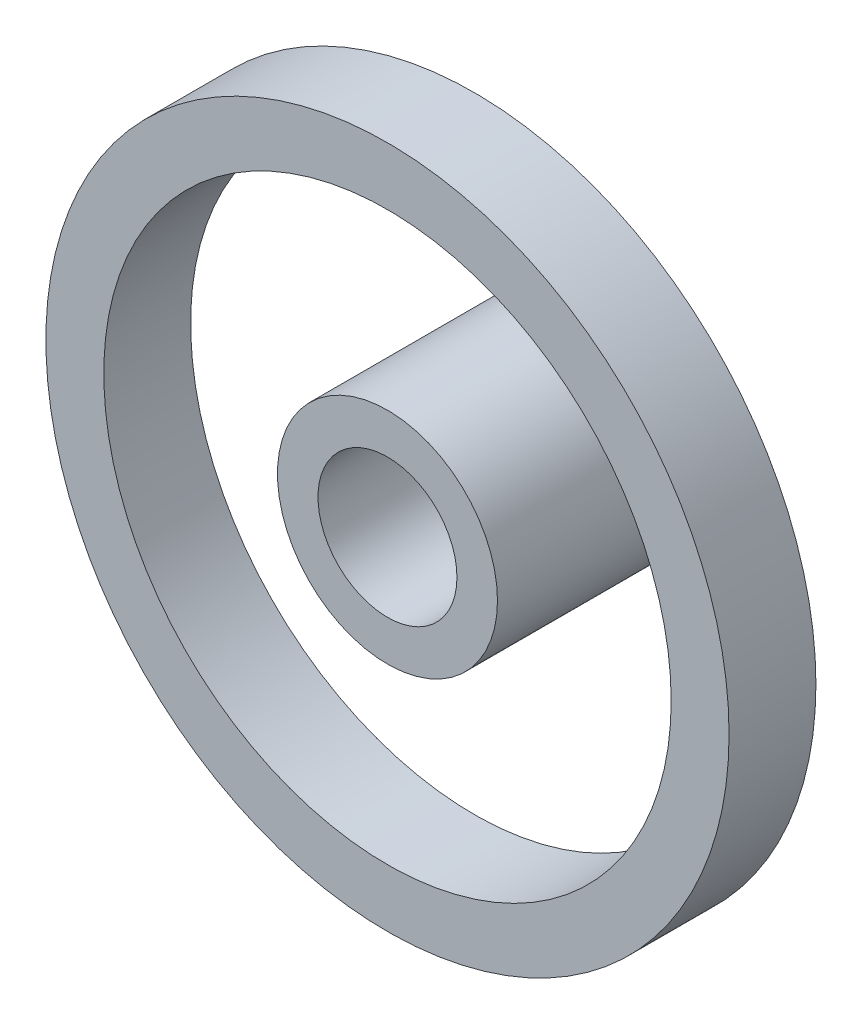
ISO-10303-21;
HEADER;
FILE_DESCRIPTION(('STEP AP214'),'2;1');
FILE_NAME('part.step','',(''),(''),'','','');
FILE_SCHEMA(('AUTOMOTIVE_DESIGN { 1 0 10303 214 1 1 1 1 }'));
ENDSEC;
DATA;
#1=APPLICATION_CONTEXT('core data for automotive mechanical design processes');
#2=APPLICATION_PROTOCOL_DEFINITION('international standard','automotive_design',2000,#1);
#3=PRODUCT_CONTEXT('',#1,'mechanical');
#4=PRODUCT('Part','Part','',(#3));
#5=PRODUCT_RELATED_PRODUCT_CATEGORY('part','',(#4));
#6=PRODUCT_DEFINITION_FORMATION('','',#4);
#7=PRODUCT_DEFINITION_CONTEXT('part definition',#1,'design');
#8=PRODUCT_DEFINITION('design','',#6,#7);
#9=PRODUCT_DEFINITION_SHAPE('','',#8);
#10=(LENGTH_UNIT() NAMED_UNIT(*) SI_UNIT(.MILLI.,.METRE.));
#11=(NAMED_UNIT(*) PLANE_ANGLE_UNIT() SI_UNIT($,.RADIAN.));
#12=(NAMED_UNIT(*) SI_UNIT($,.STERADIAN.) SOLID_ANGLE_UNIT());
#13=UNCERTAINTY_MEASURE_WITH_UNIT(LENGTH_MEASURE(1.E-05),#10,'distance_accuracy_value','');
#14=(GEOMETRIC_REPRESENTATION_CONTEXT(3) GLOBAL_UNCERTAINTY_ASSIGNED_CONTEXT((#13)) GLOBAL_UNIT_ASSIGNED_CONTEXT((#10,
#11,#12)) REPRESENTATION_CONTEXT('',''));
#15=CARTESIAN_POINT('',(0.,0.,0.));
#16=DIRECTION('',(0.,0.,1.));
#17=DIRECTION('',(1.,0.,0.));
#18=AXIS2_PLACEMENT_3D('',#15,#16,#17);
#19=CARTESIAN_POINT('',(0.,0.,2.));
#20=DIRECTION('',(0.,0.,1.));
#21=DIRECTION('',(1.,0.,0.));
#22=AXIS2_PLACEMENT_3D('',#19,#20,#21);
#23=CYLINDRICAL_SURFACE('',#22,5.9);
#24=CARTESIAN_POINT('',(0.,0.,2.));
#25=DIRECTION('',(0.,0.,1.));
#26=DIRECTION('',(1.,0.,0.));
#27=AXIS2_PLACEMENT_3D('',#24,#25,#26);
#28=CIRCLE('',#27,5.9);
#29=CARTESIAN_POINT('',(5.9,0.,2.));
#30=VERTEX_POINT('',#29);
#31=EDGE_CURVE('E11',#30,#30,#28,.T.);
#32=ORIENTED_EDGE('',*,*,#31,.T.);
#33=EDGE_LOOP('',(#32));
#34=FACE_BOUND('',#33,.T.);
#35=CARTESIAN_POINT('',(0.,0.,3.5));
#36=DIRECTION('',(0.,0.,1.));
#37=DIRECTION('',(1.,0.,0.));
#38=AXIS2_PLACEMENT_3D('',#35,#36,#37);
#39=CIRCLE('',#38,5.9);
#40=CARTESIAN_POINT('',(5.9,0.,3.5));
#41=VERTEX_POINT('',#40);
#42=EDGE_CURVE('E54',#41,#41,#39,.T.);
#43=ORIENTED_EDGE('',*,*,#42,.F.);
#44=EDGE_LOOP('',(#43));
#45=FACE_BOUND('',#44,.T.);
#46=ADVANCED_FACE('F51',(#34,#45),#23,.T.);
#47=CARTESIAN_POINT('',(0.,0.,2.));
#48=DIRECTION('',(0.,0.,1.));
#49=DIRECTION('',(1.,0.,0.));
#50=AXIS2_PLACEMENT_3D('',#47,#48,#49);
#51=PLANE('',#50);
#52=CARTESIAN_POINT('',(0.,0.,2.));
#53=DIRECTION('',(0.,0.,1.));
#54=DIRECTION('',(1.,0.,0.));
#55=AXIS2_PLACEMENT_3D('',#52,#53,#54);
#56=CIRCLE('',#55,4.9);
#57=CARTESIAN_POINT('',(4.9,0.,2.));
#58=VERTEX_POINT('',#57);
#59=EDGE_CURVE('E63',#58,#58,#56,.T.);
#60=ORIENTED_EDGE('',*,*,#59,.T.);
#61=EDGE_LOOP('',(#60));
#62=FACE_BOUND('',#61,.T.);
#63=ORIENTED_EDGE('',*,*,#31,.F.);
#64=EDGE_LOOP('',(#63));
#65=FACE_BOUND('',#64,.T.);
#66=ADVANCED_FACE('F73',(#62,#65),#51,.F.);
#67=CARTESIAN_POINT('',(0.,0.,3.5));
#68=DIRECTION('',(0.,0.,1.));
#69=DIRECTION('',(1.,0.,0.));
#70=AXIS2_PLACEMENT_3D('',#67,#68,#69);
#71=PLANE('',#70);
#72=CARTESIAN_POINT('',(0.,0.,3.5));
#73=DIRECTION('',(0.,0.,1.));
#74=DIRECTION('',(1.,0.,0.));
#75=AXIS2_PLACEMENT_3D('',#72,#73,#74);
#76=CIRCLE('',#75,4.9);
#77=CARTESIAN_POINT('',(4.9,0.,3.5));
#78=VERTEX_POINT('',#77);
#79=EDGE_CURVE('E65',#78,#78,#76,.T.);
#80=ORIENTED_EDGE('',*,*,#79,.F.);
#81=EDGE_LOOP('',(#80));
#82=FACE_BOUND('',#81,.T.);
#83=ORIENTED_EDGE('',*,*,#42,.T.);
#84=EDGE_LOOP('',(#83));
#85=FACE_BOUND('',#84,.T.);
#86=ADVANCED_FACE('F79',(#82,#85),#71,.T.);
#87=CARTESIAN_POINT('',(0.,0.,2.));
#88=DIRECTION('',(0.,0.,1.));
#89=DIRECTION('',(1.,0.,0.));
#90=AXIS2_PLACEMENT_3D('',#87,#88,#89);
#91=CYLINDRICAL_SURFACE('',#90,4.9);
#92=ORIENTED_EDGE('',*,*,#59,.F.);
#93=EDGE_LOOP('',(#92));
#94=FACE_BOUND('',#93,.T.);
#95=ORIENTED_EDGE('',*,*,#79,.T.);
#96=EDGE_LOOP('',(#95));
#97=FACE_BOUND('',#96,.T.);
#98=ADVANCED_FACE('F76',(#94,#97),#91,.F.);
#99=CLOSED_SHELL('',(#46,#66,#86,#98));
#100=MANIFOLD_SOLID_BREP('B2',#99);
#101=CARTESIAN_POINT('',(0.,0.,3.5));
#102=DIRECTION('',(0.,0.,1.));
#103=DIRECTION('',(1.,0.,0.));
#104=AXIS2_PLACEMENT_3D('',#101,#102,#103);
#105=PLANE('',#104);
#106=CARTESIAN_POINT('',(0.,0.,3.5));
#107=DIRECTION('',(0.,0.,1.));
#108=DIRECTION('',(1.,0.,0.));
#109=AXIS2_PLACEMENT_3D('',#106,#107,#108);
#110=CIRCLE('',#109,1.9);
#111=CARTESIAN_POINT('',(1.9,0.,3.5));
#112=VERTEX_POINT('',#111);
#113=EDGE_CURVE('E50',#112,#112,#110,.T.);
#114=ORIENTED_EDGE('',*,*,#113,.T.);
#115=EDGE_LOOP('',(#114));
#116=FACE_BOUND('',#115,.T.);
#117=CARTESIAN_POINT('',(0.,0.,3.5));
#118=DIRECTION('',(0.,0.,1.));
#119=DIRECTION('',(1.,0.,0.));
#120=AXIS2_PLACEMENT_3D('',#117,#118,#119);
#121=CIRCLE('',#120,1.2);
#122=CARTESIAN_POINT('',(1.2,0.,3.5));
#123=VERTEX_POINT('',#122);
#124=EDGE_CURVE('E128',#123,#123,#121,.T.);
#125=ORIENTED_EDGE('',*,*,#124,.F.);
#126=EDGE_LOOP('',(#125));
#127=FACE_BOUND('',#126,.T.);
#128=ADVANCED_FACE('F117',(#116,#127),#105,.T.);
#129=CARTESIAN_POINT('',(0.,0.,0.));
#130=DIRECTION('',(0.,0.,1.));
#131=DIRECTION('',(1.,0.,0.));
#132=AXIS2_PLACEMENT_3D('',#129,#130,#131);
#133=PLANE('',#132);
#134=CARTESIAN_POINT('',(0.,0.,0.));
#135=DIRECTION('',(0.,0.,1.));
#136=DIRECTION('',(1.,0.,0.));
#137=AXIS2_PLACEMENT_3D('',#134,#135,#136);
#138=CIRCLE('',#137,1.9);
#139=CARTESIAN_POINT('',(1.9,0.,0.));
#140=VERTEX_POINT('',#139);
#141=EDGE_CURVE('E121',#140,#140,#138,.T.);
#142=ORIENTED_EDGE('',*,*,#141,.F.);
#143=EDGE_LOOP('',(#142));
#144=FACE_BOUND('',#143,.T.);
#145=CARTESIAN_POINT('',(0.,0.,0.));
#146=DIRECTION('',(0.,0.,1.));
#147=DIRECTION('',(1.,0.,0.));
#148=AXIS2_PLACEMENT_3D('',#145,#146,#147);
#149=CIRCLE('',#148,1.2);
#150=CARTESIAN_POINT('',(1.2,0.,0.));
#151=VERTEX_POINT('',#150);
#152=EDGE_CURVE('E130',#151,#151,#149,.T.);
#153=ORIENTED_EDGE('',*,*,#152,.T.);
#154=EDGE_LOOP('',(#153));
#155=FACE_BOUND('',#154,.T.);
#156=ADVANCED_FACE('F140',(#144,#155),#133,.F.);
#157=CARTESIAN_POINT('',(0.,0.,3.5));
#158=DIRECTION('',(0.,0.,-1.));
#159=DIRECTION('',(-1.,0.,0.));
#160=AXIS2_PLACEMENT_3D('',#157,#158,#159);
#161=CYLINDRICAL_SURFACE('',#160,1.9);
#162=ORIENTED_EDGE('',*,*,#113,.F.);
#163=EDGE_LOOP('',(#162));
#164=FACE_BOUND('',#163,.T.);
#165=ORIENTED_EDGE('',*,*,#141,.T.);
#166=EDGE_LOOP('',(#165));
#167=FACE_BOUND('',#166,.T.);
#168=ADVANCED_FACE('F119',(#164,#167),#161,.T.);
#169=CARTESIAN_POINT('',(0.,0.,3.5));
#170=DIRECTION('',(0.,0.,-1.));
#171=DIRECTION('',(-1.,0.,0.));
#172=AXIS2_PLACEMENT_3D('',#169,#170,#171);
#173=CYLINDRICAL_SURFACE('',#172,1.2);
#174=ORIENTED_EDGE('',*,*,#124,.T.);
#175=EDGE_LOOP('',(#174));
#176=FACE_BOUND('',#175,.T.);
#177=ORIENTED_EDGE('',*,*,#152,.F.);
#178=EDGE_LOOP('',(#177));
#179=FACE_BOUND('',#178,.T.);
#180=ADVANCED_FACE('F136',(#176,#179),#173,.F.);
#181=CLOSED_SHELL('',(#128,#156,#168,#180));
#182=MANIFOLD_SOLID_BREP('B6',#181);
#183=ADVANCED_BREP_SHAPE_REPRESENTATION('',(#18,#100,#182),#14);
#184=SHAPE_DEFINITION_REPRESENTATION(#9,#183);
ENDSEC;
END-ISO-10303-21;
